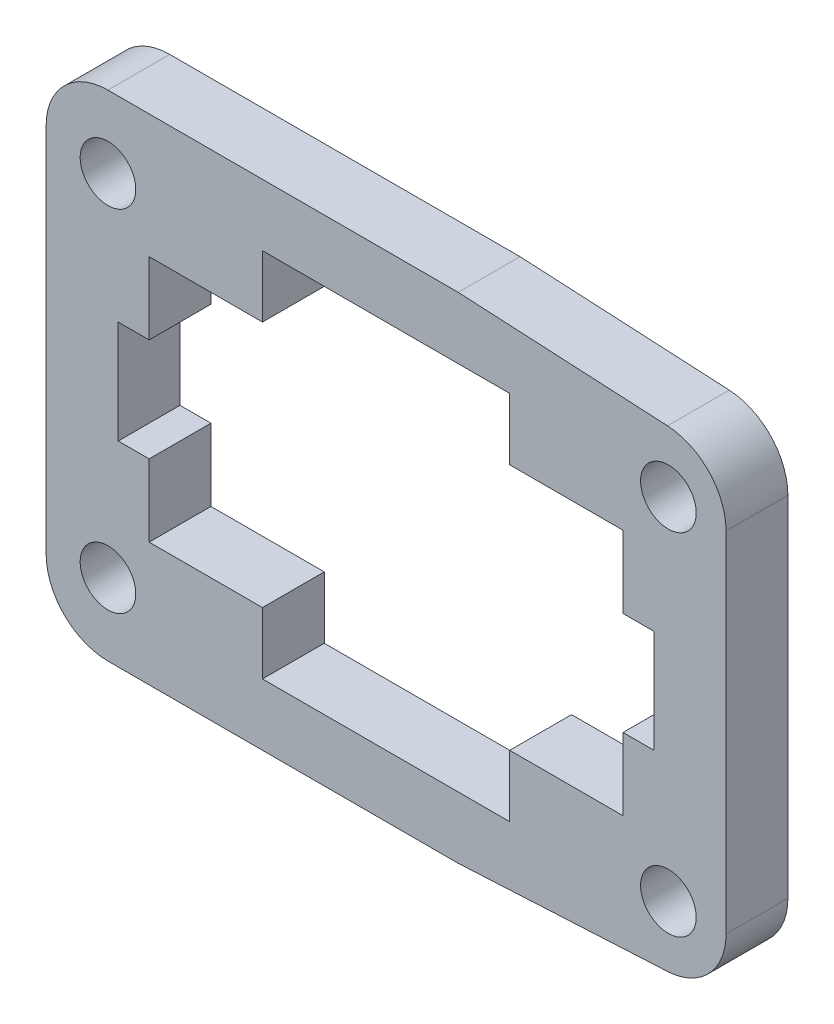
ISO-10303-21;
HEADER;
FILE_DESCRIPTION(('STEP AP214'),'2;1');
FILE_NAME('part.step','',(''),(''),'','','');
FILE_SCHEMA(('AUTOMOTIVE_DESIGN { 1 0 10303 214 1 1 1 1 }'));
ENDSEC;
DATA;
#1=APPLICATION_CONTEXT('core data for automotive mechanical design processes');
#2=APPLICATION_PROTOCOL_DEFINITION('international standard','automotive_design',2000,#1);
#3=PRODUCT_CONTEXT('',#1,'mechanical');
#4=PRODUCT('Part','Part','',(#3));
#5=PRODUCT_RELATED_PRODUCT_CATEGORY('part','',(#4));
#6=PRODUCT_DEFINITION_FORMATION('','',#4);
#7=PRODUCT_DEFINITION_CONTEXT('part definition',#1,'design');
#8=PRODUCT_DEFINITION('design','',#6,#7);
#9=PRODUCT_DEFINITION_SHAPE('','',#8);
#10=(LENGTH_UNIT() NAMED_UNIT(*) SI_UNIT(.MILLI.,.METRE.));
#11=(NAMED_UNIT(*) PLANE_ANGLE_UNIT() SI_UNIT($,.RADIAN.));
#12=(NAMED_UNIT(*) SI_UNIT($,.STERADIAN.) SOLID_ANGLE_UNIT());
#13=UNCERTAINTY_MEASURE_WITH_UNIT(LENGTH_MEASURE(1.E-05),#10,'distance_accuracy_value','');
#14=(GEOMETRIC_REPRESENTATION_CONTEXT(3) GLOBAL_UNCERTAINTY_ASSIGNED_CONTEXT((#13)) GLOBAL_UNIT_ASSIGNED_CONTEXT((#10,
#11,#12)) REPRESENTATION_CONTEXT('',''));
#15=CARTESIAN_POINT('',(0.,0.,0.));
#16=DIRECTION('',(0.,0.,1.));
#17=DIRECTION('',(1.,0.,0.));
#18=AXIS2_PLACEMENT_3D('',#15,#16,#17);
#19=CARTESIAN_POINT('',(-3.15711815612296,20.9998,0.));
#20=DIRECTION('',(0.,0.,1.));
#21=DIRECTION('',(1.,0.,0.));
#22=AXIS2_PLACEMENT_3D('',#19,#20,#21);
#23=CYLINDRICAL_SURFACE('',#22,3.);
#24=CARTESIAN_POINT('',(-3.15711815612296,20.9998,3.));
#25=DIRECTION('',(0.,0.,1.));
#26=DIRECTION('',(1.,0.,0.));
#27=AXIS2_PLACEMENT_3D('',#24,#25,#26);
#28=CIRCLE('',#27,3.);
#29=CARTESIAN_POINT('',(-3.15711815612296,23.9998,3.));
#30=VERTEX_POINT('',#29);
#31=CARTESIAN_POINT('',(-6.15711815612297,20.9998,3.));
#32=VERTEX_POINT('',#31);
#33=EDGE_CURVE('E420',#30,#32,#28,.T.);
#34=ORIENTED_EDGE('',*,*,#33,.F.);
#35=DIRECTION('',(0.,0.,1.));
#36=VECTOR('',#35,1.);
#37=CARTESIAN_POINT('',(-3.15711815612296,23.9998,0.));
#38=LINE('',#37,#36);
#39=CARTESIAN_POINT('',(-3.15711815612296,23.9998,0.));
#40=VERTEX_POINT('',#39);
#41=EDGE_CURVE('E11',#40,#30,#38,.T.);
#42=ORIENTED_EDGE('',*,*,#41,.F.);
#43=CARTESIAN_POINT('',(-3.15711815612296,20.9998,0.));
#44=DIRECTION('',(0.,0.,1.));
#45=DIRECTION('',(1.,0.,0.));
#46=AXIS2_PLACEMENT_3D('',#43,#44,#45);
#47=CIRCLE('',#46,3.);
#48=CARTESIAN_POINT('',(-6.15711815612297,20.9998,0.));
#49=VERTEX_POINT('',#48);
#50=EDGE_CURVE('E423',#40,#49,#47,.T.);
#51=ORIENTED_EDGE('',*,*,#50,.T.);
#52=DIRECTION('',(0.,0.,1.));
#53=VECTOR('',#52,1.);
#54=CARTESIAN_POINT('',(-6.15711815612297,20.9998,0.));
#55=LINE('',#54,#53);
#56=EDGE_CURVE('E40',#49,#32,#55,.T.);
#57=ORIENTED_EDGE('',*,*,#56,.T.);
#58=EDGE_LOOP('',(#34,#42,#51,#57));
#59=FACE_BOUND('',#58,.T.);
#60=ADVANCED_FACE('F37',(#59),#23,.T.);
#61=CARTESIAN_POINT('',(13.8436818438771,23.9998,0.));
#62=DIRECTION('',(0.,1.,0.));
#63=DIRECTION('',(0.,0.,1.));
#64=AXIS2_PLACEMENT_3D('',#61,#62,#63);
#65=PLANE('',#64);
#66=DIRECTION('',(-1.,0.,0.));
#67=VECTOR('',#66,1.);
#68=CARTESIAN_POINT('',(13.8436818438771,23.9998,3.));
#69=LINE('',#68,#67);
#70=CARTESIAN_POINT('',(13.8436818438771,23.9998,3.));
#71=VERTEX_POINT('',#70);
#72=EDGE_CURVE('E427',#71,#30,#69,.T.);
#73=ORIENTED_EDGE('',*,*,#72,.F.);
#74=DIRECTION('',(0.,0.,1.));
#75=VECTOR('',#74,1.);
#76=CARTESIAN_POINT('',(13.8436818438771,23.9998,0.));
#77=LINE('',#76,#75);
#78=CARTESIAN_POINT('',(13.8436818438771,23.9998,0.));
#79=VERTEX_POINT('',#78);
#80=EDGE_CURVE('E45',#79,#71,#77,.T.);
#81=ORIENTED_EDGE('',*,*,#80,.F.);
#82=DIRECTION('',(-1.,0.,0.));
#83=VECTOR('',#82,1.);
#84=CARTESIAN_POINT('',(13.8436818438771,23.9998,0.));
#85=LINE('',#84,#83);
#86=EDGE_CURVE('E451',#79,#40,#85,.T.);
#87=ORIENTED_EDGE('',*,*,#86,.T.);
#88=ORIENTED_EDGE('',*,*,#41,.T.);
#89=EDGE_LOOP('',(#73,#81,#87,#88));
#90=FACE_BOUND('',#89,.T.);
#91=ADVANCED_FACE('F508',(#90),#65,.T.);
#92=CARTESIAN_POINT('',(24.0010920540107,23.4678047027526,0.));
#93=DIRECTION('',(0.0523034033778749,0.998631240245913,0.));
#94=DIRECTION('',(-0.998631240245914,0.0523034033778749,0.));
#95=AXIS2_PLACEMENT_3D('',#92,#93,#94);
#96=PLANE('',#95);
#97=DIRECTION('',(-0.998631240245914,0.0523034033778749,0.));
#98=VECTOR('',#97,1.);
#99=CARTESIAN_POINT('',(24.0010920540107,23.4678047027526,3.));
#100=LINE('',#99,#98);
#101=CARTESIAN_POINT('',(24.0010920540107,23.4678047027526,3.));
#102=VERTEX_POINT('',#101);
#103=EDGE_CURVE('E477',#102,#71,#100,.T.);
#104=ORIENTED_EDGE('',*,*,#103,.F.);
#105=DIRECTION('',(0.,0.,1.));
#106=VECTOR('',#105,1.);
#107=CARTESIAN_POINT('',(24.0010920540107,23.4678047027526,0.));
#108=LINE('',#107,#106);
#109=CARTESIAN_POINT('',(24.0010920540107,23.4678047027526,0.));
#110=VERTEX_POINT('',#109);
#111=EDGE_CURVE('E483',#110,#102,#108,.T.);
#112=ORIENTED_EDGE('',*,*,#111,.F.);
#113=DIRECTION('',(-0.998631240245914,0.0523034033778749,0.));
#114=VECTOR('',#113,1.);
#115=CARTESIAN_POINT('',(24.0010920540107,23.4678047027526,0.));
#116=LINE('',#115,#114);
#117=EDGE_CURVE('E448',#110,#79,#116,.T.);
#118=ORIENTED_EDGE('',*,*,#117,.T.);
#119=ORIENTED_EDGE('',*,*,#80,.T.);
#120=EDGE_LOOP('',(#104,#112,#118,#119));
#121=FACE_BOUND('',#120,.T.);
#122=ADVANCED_FACE('F536',(#121),#96,.T.);
#123=CARTESIAN_POINT('',(23.844181843877,20.4719109820149,0.));
#124=DIRECTION('',(0.,0.,1.));
#125=DIRECTION('',(1.,0.,0.));
#126=AXIS2_PLACEMENT_3D('',#123,#124,#125);
#127=CYLINDRICAL_SURFACE('',#126,3.00000000000001);
#128=CARTESIAN_POINT('',(23.844181843877,20.4719109820149,3.));
#129=DIRECTION('',(0.,0.,1.));
#130=DIRECTION('',(1.,0.,0.));
#131=AXIS2_PLACEMENT_3D('',#128,#129,#130);
#132=CIRCLE('',#131,3.00000000000001);
#133=CARTESIAN_POINT('',(26.844181843877,20.4719109820149,3.));
#134=VERTEX_POINT('',#133);
#135=EDGE_CURVE('E474',#134,#102,#132,.T.);
#136=ORIENTED_EDGE('',*,*,#135,.F.);
#137=DIRECTION('',(0.,0.,1.));
#138=VECTOR('',#137,1.);
#139=CARTESIAN_POINT('',(26.844181843877,20.4719109820149,0.));
#140=LINE('',#139,#138);
#141=CARTESIAN_POINT('',(26.844181843877,20.4719109820149,0.));
#142=VERTEX_POINT('',#141);
#143=EDGE_CURVE('E485',#142,#134,#140,.T.);
#144=ORIENTED_EDGE('',*,*,#143,.F.);
#145=CARTESIAN_POINT('',(23.844181843877,20.4719109820149,0.));
#146=DIRECTION('',(0.,0.,1.));
#147=DIRECTION('',(1.,0.,0.));
#148=AXIS2_PLACEMENT_3D('',#145,#146,#147);
#149=CIRCLE('',#148,3.00000000000001);
#150=EDGE_CURVE('E445',#142,#110,#149,.T.);
#151=ORIENTED_EDGE('',*,*,#150,.T.);
#152=ORIENTED_EDGE('',*,*,#111,.T.);
#153=EDGE_LOOP('',(#136,#144,#151,#152));
#154=FACE_BOUND('',#153,.T.);
#155=ADVANCED_FACE('F534',(#154),#127,.T.);
#156=CARTESIAN_POINT('',(26.844181843877,3.52888902362418,0.));
#157=DIRECTION('',(1.,0.,0.));
#158=DIRECTION('',(0.,0.,-1.));
#159=AXIS2_PLACEMENT_3D('',#156,#157,#158);
#160=PLANE('',#159);
#161=DIRECTION('',(0.,1.,0.));
#162=VECTOR('',#161,1.);
#163=CARTESIAN_POINT('',(26.844181843877,3.52888902362418,3.));
#164=LINE('',#163,#162);
#165=CARTESIAN_POINT('',(26.844181843877,3.52888902362418,3.));
#166=VERTEX_POINT('',#165);
#167=EDGE_CURVE('E471',#166,#134,#164,.T.);
#168=ORIENTED_EDGE('',*,*,#167,.F.);
#169=DIRECTION('',(0.,0.,1.));
#170=VECTOR('',#169,1.);
#171=CARTESIAN_POINT('',(26.844181843877,3.52888902362418,0.));
#172=LINE('',#171,#170);
#173=CARTESIAN_POINT('',(26.844181843877,3.52888902362418,0.));
#174=VERTEX_POINT('',#173);
#175=EDGE_CURVE('E487',#174,#166,#172,.T.);
#176=ORIENTED_EDGE('',*,*,#175,.F.);
#177=DIRECTION('',(0.,1.,0.));
#178=VECTOR('',#177,1.);
#179=CARTESIAN_POINT('',(26.844181843877,3.52888902362418,0.));
#180=LINE('',#179,#178);
#181=EDGE_CURVE('E442',#174,#142,#180,.T.);
#182=ORIENTED_EDGE('',*,*,#181,.T.);
#183=ORIENTED_EDGE('',*,*,#143,.T.);
#184=EDGE_LOOP('',(#168,#176,#182,#183));
#185=FACE_BOUND('',#184,.T.);
#186=ADVANCED_FACE('F530',(#185),#160,.T.);
#187=CARTESIAN_POINT('',(23.844181843877,3.52888902362418,0.));
#188=DIRECTION('',(0.,0.,1.));
#189=DIRECTION('',(1.,0.,0.));
#190=AXIS2_PLACEMENT_3D('',#187,#188,#189);
#191=CYLINDRICAL_SURFACE('',#190,3.);
#192=CARTESIAN_POINT('',(23.844181843877,3.52888902362418,3.));
#193=DIRECTION('',(0.,0.,1.));
#194=DIRECTION('',(1.,0.,0.));
#195=AXIS2_PLACEMENT_3D('',#192,#193,#194);
#196=CIRCLE('',#195,3.);
#197=CARTESIAN_POINT('',(24.0013861888822,0.533010722706153,3.));
#198=VERTEX_POINT('',#197);
#199=EDGE_CURVE('E468',#198,#166,#196,.T.);
#200=ORIENTED_EDGE('',*,*,#199,.F.);
#201=DIRECTION('',(0.,0.,1.));
#202=VECTOR('',#201,1.);
#203=CARTESIAN_POINT('',(24.0013861888822,0.533010722706153,0.));
#204=LINE('',#203,#202);
#205=CARTESIAN_POINT('',(24.0013861888822,0.533010722706153,0.));
#206=VERTEX_POINT('',#205);
#207=EDGE_CURVE('E489',#206,#198,#204,.T.);
#208=ORIENTED_EDGE('',*,*,#207,.F.);
#209=CARTESIAN_POINT('',(23.844181843877,3.52888902362418,0.));
#210=DIRECTION('',(0.,0.,1.));
#211=DIRECTION('',(1.,0.,0.));
#212=AXIS2_PLACEMENT_3D('',#209,#210,#211);
#213=CIRCLE('',#212,3.);
#214=EDGE_CURVE('E439',#206,#174,#213,.T.);
#215=ORIENTED_EDGE('',*,*,#214,.T.);
#216=ORIENTED_EDGE('',*,*,#175,.T.);
#217=EDGE_LOOP('',(#200,#208,#215,#216));
#218=FACE_BOUND('',#217,.T.);
#219=ADVANCED_FACE('F526',(#218),#191,.T.);
#220=CARTESIAN_POINT('',(13.8436818438771,0.,0.));
#221=DIRECTION('',(0.0524014483350334,-0.998626100306011,0.));
#222=DIRECTION('',(0.998626100306011,0.0524014483350334,0.));
#223=AXIS2_PLACEMENT_3D('',#220,#221,#222);
#224=PLANE('',#223);
#225=DIRECTION('',(0.998626100306011,0.0524014483350334,0.));
#226=VECTOR('',#225,1.);
#227=CARTESIAN_POINT('',(13.8436818438771,0.,3.));
#228=LINE('',#227,#226);
#229=CARTESIAN_POINT('',(13.8436818438771,0.,3.));
#230=VERTEX_POINT('',#229);
#231=EDGE_CURVE('E465',#230,#198,#228,.T.);
#232=ORIENTED_EDGE('',*,*,#231,.F.);
#233=DIRECTION('',(0.,0.,1.));
#234=VECTOR('',#233,1.);
#235=CARTESIAN_POINT('',(13.8436818438771,0.,0.));
#236=LINE('',#235,#234);
#237=CARTESIAN_POINT('',(13.8436818438771,0.,0.));
#238=VERTEX_POINT('',#237);
#239=EDGE_CURVE('E491',#238,#230,#236,.T.);
#240=ORIENTED_EDGE('',*,*,#239,.F.);
#241=DIRECTION('',(0.998626100306011,0.0524014483350334,0.));
#242=VECTOR('',#241,1.);
#243=CARTESIAN_POINT('',(13.8436818438771,0.,0.));
#244=LINE('',#243,#242);
#245=EDGE_CURVE('E436',#238,#206,#244,.T.);
#246=ORIENTED_EDGE('',*,*,#245,.T.);
#247=ORIENTED_EDGE('',*,*,#207,.T.);
#248=EDGE_LOOP('',(#232,#240,#246,#247));
#249=FACE_BOUND('',#248,.T.);
#250=ADVANCED_FACE('F522',(#249),#224,.T.);
#251=CARTESIAN_POINT('',(-3.15711815612296,0.,0.));
#252=DIRECTION('',(0.,-1.,0.));
#253=DIRECTION('',(1.,0.,0.));
#254=AXIS2_PLACEMENT_3D('',#251,#252,#253);
#255=PLANE('',#254);
#256=DIRECTION('',(1.,0.,0.));
#257=VECTOR('',#256,1.);
#258=CARTESIAN_POINT('',(-3.15711815612296,0.,3.));
#259=LINE('',#258,#257);
#260=CARTESIAN_POINT('',(-3.15711815612297,0.,3.));
#261=VERTEX_POINT('',#260);
#262=EDGE_CURVE('E462',#261,#230,#259,.T.);
#263=ORIENTED_EDGE('',*,*,#262,.F.);
#264=DIRECTION('',(0.,0.,1.));
#265=VECTOR('',#264,1.);
#266=CARTESIAN_POINT('',(-3.15711815612297,0.,0.));
#267=LINE('',#266,#265);
#268=CARTESIAN_POINT('',(-3.15711815612297,0.,0.));
#269=VERTEX_POINT('',#268);
#270=EDGE_CURVE('E493',#269,#261,#267,.T.);
#271=ORIENTED_EDGE('',*,*,#270,.F.);
#272=DIRECTION('',(1.,0.,0.));
#273=VECTOR('',#272,1.);
#274=CARTESIAN_POINT('',(-3.15711815612296,0.,0.));
#275=LINE('',#274,#273);
#276=EDGE_CURVE('E433',#269,#238,#275,.T.);
#277=ORIENTED_EDGE('',*,*,#276,.T.);
#278=ORIENTED_EDGE('',*,*,#239,.T.);
#279=EDGE_LOOP('',(#263,#271,#277,#278));
#280=FACE_BOUND('',#279,.T.);
#281=ADVANCED_FACE('F520',(#280),#255,.T.);
#282=CARTESIAN_POINT('',(-3.15711815612296,3.,0.));
#283=DIRECTION('',(0.,0.,1.));
#284=DIRECTION('',(1.,0.,0.));
#285=AXIS2_PLACEMENT_3D('',#282,#283,#284);
#286=CYLINDRICAL_SURFACE('',#285,3.);
#287=CARTESIAN_POINT('',(-3.15711815612296,3.,3.));
#288=DIRECTION('',(0.,0.,1.));
#289=DIRECTION('',(1.,0.,0.));
#290=AXIS2_PLACEMENT_3D('',#287,#288,#289);
#291=CIRCLE('',#290,3.);
#292=CARTESIAN_POINT('',(-6.15711815612297,3.,3.));
#293=VERTEX_POINT('',#292);
#294=EDGE_CURVE('E459',#293,#261,#291,.T.);
#295=ORIENTED_EDGE('',*,*,#294,.F.);
#296=DIRECTION('',(0.,0.,1.));
#297=VECTOR('',#296,1.);
#298=CARTESIAN_POINT('',(-6.15711815612297,3.,0.));
#299=LINE('',#298,#297);
#300=CARTESIAN_POINT('',(-6.15711815612297,3.,0.));
#301=VERTEX_POINT('',#300);
#302=EDGE_CURVE('E494',#301,#293,#299,.T.);
#303=ORIENTED_EDGE('',*,*,#302,.F.);
#304=CARTESIAN_POINT('',(-3.15711815612296,3.,0.));
#305=DIRECTION('',(0.,0.,1.));
#306=DIRECTION('',(1.,0.,0.));
#307=AXIS2_PLACEMENT_3D('',#304,#305,#306);
#308=CIRCLE('',#307,3.);
#309=EDGE_CURVE('E430',#301,#269,#308,.T.);
#310=ORIENTED_EDGE('',*,*,#309,.T.);
#311=ORIENTED_EDGE('',*,*,#270,.T.);
#312=EDGE_LOOP('',(#295,#303,#310,#311));
#313=FACE_BOUND('',#312,.T.);
#314=ADVANCED_FACE('F516',(#313),#286,.T.);
#315=CARTESIAN_POINT('',(-6.15711815612297,20.9998,0.));
#316=DIRECTION('',(-1.,0.,0.));
#317=DIRECTION('',(0.,0.,1.));
#318=AXIS2_PLACEMENT_3D('',#315,#316,#317);
#319=PLANE('',#318);
#320=DIRECTION('',(0.,-1.,0.));
#321=VECTOR('',#320,1.);
#322=CARTESIAN_POINT('',(-6.15711815612297,20.9998,3.));
#323=LINE('',#322,#321);
#324=EDGE_CURVE('E456',#32,#293,#323,.T.);
#325=ORIENTED_EDGE('',*,*,#324,.F.);
#326=ORIENTED_EDGE('',*,*,#56,.F.);
#327=DIRECTION('',(0.,-1.,0.));
#328=VECTOR('',#327,1.);
#329=CARTESIAN_POINT('',(-6.15711815612297,20.9998,0.));
#330=LINE('',#329,#328);
#331=EDGE_CURVE('E426',#49,#301,#330,.T.);
#332=ORIENTED_EDGE('',*,*,#331,.T.);
#333=ORIENTED_EDGE('',*,*,#302,.T.);
#334=EDGE_LOOP('',(#325,#326,#332,#333));
#335=FACE_BOUND('',#334,.T.);
#336=ADVANCED_FACE('F502',(#335),#319,.T.);
#337=CARTESIAN_POINT('',(-3.15711815612296,20.9998,0.));
#338=DIRECTION('',(0.,0.,1.));
#339=DIRECTION('',(1.,0.,0.));
#340=AXIS2_PLACEMENT_3D('',#337,#338,#339);
#341=PLANE('',#340);
#342=DIRECTION('',(1.,0.,0.));
#343=VECTOR('',#342,1.);
#344=CARTESIAN_POINT('',(23.343481843877,9.5,0.));
#345=LINE('',#344,#343);
#346=CARTESIAN_POINT('',(21.843181843877,9.5,0.));
#347=VERTEX_POINT('',#346);
#348=CARTESIAN_POINT('',(23.343481843877,9.5,0.));
#349=VERTEX_POINT('',#348);
#350=EDGE_CURVE('E242',#347,#349,#345,.T.);
#351=ORIENTED_EDGE('',*,*,#350,.T.);
#352=DIRECTION('',(0.,1.,0.));
#353=VECTOR('',#352,1.);
#354=CARTESIAN_POINT('',(23.343481843877,14.4995,0.));
#355=LINE('',#354,#353);
#356=CARTESIAN_POINT('',(23.343481843877,14.4995,0.));
#357=VERTEX_POINT('',#356);
#358=EDGE_CURVE('E236',#349,#357,#355,.T.);
#359=ORIENTED_EDGE('',*,*,#358,.T.);
#360=DIRECTION('',(-1.,0.,0.));
#361=VECTOR('',#360,1.);
#362=CARTESIAN_POINT('',(21.843181843877,14.4995,0.));
#363=LINE('',#362,#361);
#364=CARTESIAN_POINT('',(21.843181843877,14.4995,0.));
#365=VERTEX_POINT('',#364);
#366=EDGE_CURVE('E245',#357,#365,#363,.T.);
#367=ORIENTED_EDGE('',*,*,#366,.T.);
#368=DIRECTION('',(0.,1.,0.));
#369=VECTOR('',#368,1.);
#370=CARTESIAN_POINT('',(21.843181843877,17.9998,0.));
#371=LINE('',#370,#369);
#372=CARTESIAN_POINT('',(21.843181843877,17.9998,0.));
#373=VERTEX_POINT('',#372);
#374=EDGE_CURVE('E53',#365,#373,#371,.T.);
#375=ORIENTED_EDGE('',*,*,#374,.T.);
#376=DIRECTION('',(-1.,0.,0.));
#377=VECTOR('',#376,1.);
#378=CARTESIAN_POINT('',(16.3433818438771,17.9998,0.));
#379=LINE('',#378,#377);
#380=CARTESIAN_POINT('',(16.3433818438771,17.9998,0.));
#381=VERTEX_POINT('',#380);
#382=EDGE_CURVE('E260',#373,#381,#379,.T.);
#383=ORIENTED_EDGE('',*,*,#382,.T.);
#384=DIRECTION('',(0.,1.,0.));
#385=VECTOR('',#384,1.);
#386=CARTESIAN_POINT('',(16.3433818438771,20.9998,0.));
#387=LINE('',#386,#385);
#388=CARTESIAN_POINT('',(16.3433818438771,20.9998,0.));
#389=VERTEX_POINT('',#388);
#390=EDGE_CURVE('E263',#381,#389,#387,.T.);
#391=ORIENTED_EDGE('',*,*,#390,.T.);
#392=DIRECTION('',(-1.,0.,0.));
#393=VECTOR('',#392,1.);
#394=CARTESIAN_POINT('',(4.34338184387702,20.9998,0.));
#395=LINE('',#394,#393);
#396=CARTESIAN_POINT('',(4.34338184387702,20.9998,0.));
#397=VERTEX_POINT('',#396);
#398=EDGE_CURVE('E266',#389,#397,#395,.T.);
#399=ORIENTED_EDGE('',*,*,#398,.T.);
#400=DIRECTION('',(0.,-1.,0.));
#401=VECTOR('',#400,1.);
#402=CARTESIAN_POINT('',(4.34338184387702,17.9998,0.));
#403=LINE('',#402,#401);
#404=CARTESIAN_POINT('',(4.34338184387702,17.9998,0.));
#405=VERTEX_POINT('',#404);
#406=EDGE_CURVE('E269',#397,#405,#403,.T.);
#407=ORIENTED_EDGE('',*,*,#406,.T.);
#408=DIRECTION('',(-1.,0.,0.));
#409=VECTOR('',#408,1.);
#410=CARTESIAN_POINT('',(-1.15651815612298,17.9998,0.));
#411=LINE('',#410,#409);
#412=CARTESIAN_POINT('',(-1.15651815612298,17.9998,0.));
#413=VERTEX_POINT('',#412);
#414=EDGE_CURVE('E272',#405,#413,#411,.T.);
#415=ORIENTED_EDGE('',*,*,#414,.T.);
#416=DIRECTION('',(0.,-1.,0.));
#417=VECTOR('',#416,1.);
#418=CARTESIAN_POINT('',(-1.15651815612297,14.4995,0.));
#419=LINE('',#418,#417);
#420=CARTESIAN_POINT('',(-1.15651815612297,14.4995,0.));
#421=VERTEX_POINT('',#420);
#422=EDGE_CURVE('E275',#413,#421,#419,.T.);
#423=ORIENTED_EDGE('',*,*,#422,.T.);
#424=DIRECTION('',(-1.,0.,0.));
#425=VECTOR('',#424,1.);
#426=CARTESIAN_POINT('',(-2.65681815612294,14.4995,0.));
#427=LINE('',#426,#425);
#428=CARTESIAN_POINT('',(-2.65681815612294,14.4995,0.));
#429=VERTEX_POINT('',#428);
#430=EDGE_CURVE('E278',#421,#429,#427,.T.);
#431=ORIENTED_EDGE('',*,*,#430,.T.);
#432=DIRECTION('',(0.,-1.,0.));
#433=VECTOR('',#432,1.);
#434=CARTESIAN_POINT('',(-2.65681815612294,9.5,0.));
#435=LINE('',#434,#433);
#436=CARTESIAN_POINT('',(-2.65681815612294,9.5,0.));
#437=VERTEX_POINT('',#436);
#438=EDGE_CURVE('E281',#429,#437,#435,.T.);
#439=ORIENTED_EDGE('',*,*,#438,.T.);
#440=DIRECTION('',(1.,0.,0.));
#441=VECTOR('',#440,1.);
#442=CARTESIAN_POINT('',(-1.15651815612297,9.5,0.));
#443=LINE('',#442,#441);
#444=CARTESIAN_POINT('',(-1.15651815612297,9.5,0.));
#445=VERTEX_POINT('',#444);
#446=EDGE_CURVE('E284',#437,#445,#443,.T.);
#447=ORIENTED_EDGE('',*,*,#446,.T.);
#448=DIRECTION('',(0.,-1.,0.));
#449=VECTOR('',#448,1.);
#450=CARTESIAN_POINT('',(-1.15651815612298,6.,0.));
#451=LINE('',#450,#449);
#452=CARTESIAN_POINT('',(-1.15651815612298,6.,0.));
#453=VERTEX_POINT('',#452);
#454=EDGE_CURVE('E287',#445,#453,#451,.T.);
#455=ORIENTED_EDGE('',*,*,#454,.T.);
#456=DIRECTION('',(1.,0.,0.));
#457=VECTOR('',#456,1.);
#458=CARTESIAN_POINT('',(4.34338184387701,6.,0.));
#459=LINE('',#458,#457);
#460=CARTESIAN_POINT('',(4.34338184387701,6.,0.));
#461=VERTEX_POINT('',#460);
#462=EDGE_CURVE('E290',#453,#461,#459,.T.);
#463=ORIENTED_EDGE('',*,*,#462,.T.);
#464=DIRECTION('',(0.,-1.,0.));
#465=VECTOR('',#464,1.);
#466=CARTESIAN_POINT('',(4.34338184387701,3.,0.));
#467=LINE('',#466,#465);
#468=CARTESIAN_POINT('',(4.34338184387701,3.,0.));
#469=VERTEX_POINT('',#468);
#470=EDGE_CURVE('E293',#461,#469,#467,.T.);
#471=ORIENTED_EDGE('',*,*,#470,.T.);
#472=DIRECTION('',(1.,0.,0.));
#473=VECTOR('',#472,1.);
#474=CARTESIAN_POINT('',(16.3433818438771,3.,0.));
#475=LINE('',#474,#473);
#476=CARTESIAN_POINT('',(16.3433818438771,3.,0.));
#477=VERTEX_POINT('',#476);
#478=EDGE_CURVE('E296',#469,#477,#475,.T.);
#479=ORIENTED_EDGE('',*,*,#478,.T.);
#480=DIRECTION('',(0.,1.,0.));
#481=VECTOR('',#480,1.);
#482=CARTESIAN_POINT('',(16.3433818438771,6.,0.));
#483=LINE('',#482,#481);
#484=CARTESIAN_POINT('',(16.3433818438771,6.,0.));
#485=VERTEX_POINT('',#484);
#486=EDGE_CURVE('E299',#477,#485,#483,.T.);
#487=ORIENTED_EDGE('',*,*,#486,.T.);
#488=DIRECTION('',(1.,0.,0.));
#489=VECTOR('',#488,1.);
#490=CARTESIAN_POINT('',(21.843181843877,6.,0.));
#491=LINE('',#490,#489);
#492=CARTESIAN_POINT('',(21.843181843877,6.,0.));
#493=VERTEX_POINT('',#492);
#494=EDGE_CURVE('E302',#485,#493,#491,.T.);
#495=ORIENTED_EDGE('',*,*,#494,.T.);
#496=DIRECTION('',(0.,1.,0.));
#497=VECTOR('',#496,1.);
#498=CARTESIAN_POINT('',(21.843181843877,9.5,0.));
#499=LINE('',#498,#497);
#500=EDGE_CURVE('E305',#493,#347,#499,.T.);
#501=ORIENTED_EDGE('',*,*,#500,.T.);
#502=EDGE_LOOP('',(#351,#359,#367,#375,#383,#391,#399,#407,#415,#423,#431,#439,#447,#455,#463,
#471,#479,#487,#495,#501));
#503=FACE_BOUND('',#502,.T.);
#504=CARTESIAN_POINT('',(24.044031843877,3.50114834928544,0.));
#505=DIRECTION('',(0.,0.,1.));
#506=DIRECTION('',(-1.,0.,0.));
#507=AXIS2_PLACEMENT_3D('',#504,#505,#506);
#508=CIRCLE('',#507,1.35);
#509=CARTESIAN_POINT('',(22.694031843877,3.50114834928544,0.));
#510=VERTEX_POINT('',#509);
#511=EDGE_CURVE('E399',#510,#510,#508,.T.);
#512=ORIENTED_EDGE('',*,*,#511,.T.);
#513=EDGE_LOOP('',(#512));
#514=FACE_BOUND('',#513,.T.);
#515=CARTESIAN_POINT('',(-3.15601815612294,3.50114834928544,0.));
#516=DIRECTION('',(0.,0.,1.));
#517=DIRECTION('',(-1.,0.,0.));
#518=AXIS2_PLACEMENT_3D('',#515,#516,#517);
#519=CIRCLE('',#518,1.35);
#520=CARTESIAN_POINT('',(-4.50601815612294,3.50114834928544,0.));
#521=VERTEX_POINT('',#520);
#522=EDGE_CURVE('E405',#521,#521,#519,.T.);
#523=ORIENTED_EDGE('',*,*,#522,.T.);
#524=EDGE_LOOP('',(#523));
#525=FACE_BOUND('',#524,.T.);
#526=CARTESIAN_POINT('',(24.044031843877,20.4983516507146,0.));
#527=DIRECTION('',(0.,0.,1.));
#528=DIRECTION('',(-1.,0.,0.));
#529=AXIS2_PLACEMENT_3D('',#526,#527,#528);
#530=CIRCLE('',#529,1.35);
#531=CARTESIAN_POINT('',(22.694031843877,20.4983516507146,0.));
#532=VERTEX_POINT('',#531);
#533=EDGE_CURVE('E411',#532,#532,#530,.T.);
#534=ORIENTED_EDGE('',*,*,#533,.T.);
#535=EDGE_LOOP('',(#534));
#536=FACE_BOUND('',#535,.T.);
#537=CARTESIAN_POINT('',(-3.15601815612294,20.4983516507146,0.));
#538=DIRECTION('',(0.,0.,1.));
#539=DIRECTION('',(-1.,0.,0.));
#540=AXIS2_PLACEMENT_3D('',#537,#538,#539);
#541=CIRCLE('',#540,1.35);
#542=CARTESIAN_POINT('',(-4.50601815612294,20.4983516507146,0.));
#543=VERTEX_POINT('',#542);
#544=EDGE_CURVE('E417',#543,#543,#541,.T.);
#545=ORIENTED_EDGE('',*,*,#544,.T.);
#546=EDGE_LOOP('',(#545));
#547=FACE_BOUND('',#546,.T.);
#548=ORIENTED_EDGE('',*,*,#50,.F.);
#549=ORIENTED_EDGE('',*,*,#86,.F.);
#550=ORIENTED_EDGE('',*,*,#117,.F.);
#551=ORIENTED_EDGE('',*,*,#150,.F.);
#552=ORIENTED_EDGE('',*,*,#181,.F.);
#553=ORIENTED_EDGE('',*,*,#214,.F.);
#554=ORIENTED_EDGE('',*,*,#245,.F.);
#555=ORIENTED_EDGE('',*,*,#276,.F.);
#556=ORIENTED_EDGE('',*,*,#309,.F.);
#557=ORIENTED_EDGE('',*,*,#331,.F.);
#558=EDGE_LOOP('',(#548,#549,#550,#551,#552,#553,#554,#555,#556,#557));
#559=FACE_BOUND('',#558,.T.);
#560=ADVANCED_FACE('F249',(#503,#514,#525,#536,#547,#559),#341,.F.);
#561=CARTESIAN_POINT('',(-3.15711815612296,20.9998,3.));
#562=DIRECTION('',(0.,0.,1.));
#563=DIRECTION('',(1.,0.,0.));
#564=AXIS2_PLACEMENT_3D('',#561,#562,#563);
#565=PLANE('',#564);
#566=DIRECTION('',(0.,1.,0.));
#567=VECTOR('',#566,1.);
#568=CARTESIAN_POINT('',(23.343481843877,14.4995,3.));
#569=LINE('',#568,#567);
#570=CARTESIAN_POINT('',(23.343481843877,9.5,3.));
#571=VERTEX_POINT('',#570);
#572=CARTESIAN_POINT('',(23.343481843877,14.4995,3.));
#573=VERTEX_POINT('',#572);
#574=EDGE_CURVE('E61',#571,#573,#569,.T.);
#575=ORIENTED_EDGE('',*,*,#574,.F.);
#576=DIRECTION('',(1.,0.,0.));
#577=VECTOR('',#576,1.);
#578=CARTESIAN_POINT('',(23.343481843877,9.5,3.));
#579=LINE('',#578,#577);
#580=CARTESIAN_POINT('',(21.843181843877,9.5,3.));
#581=VERTEX_POINT('',#580);
#582=EDGE_CURVE('E253',#581,#571,#579,.T.);
#583=ORIENTED_EDGE('',*,*,#582,.F.);
#584=DIRECTION('',(0.,1.,0.));
#585=VECTOR('',#584,1.);
#586=CARTESIAN_POINT('',(21.843181843877,9.5,3.));
#587=LINE('',#586,#585);
#588=CARTESIAN_POINT('',(21.843181843877,6.,3.));
#589=VERTEX_POINT('',#588);
#590=EDGE_CURVE('E256',#589,#581,#587,.T.);
#591=ORIENTED_EDGE('',*,*,#590,.F.);
#592=DIRECTION('',(1.,0.,0.));
#593=VECTOR('',#592,1.);
#594=CARTESIAN_POINT('',(21.843181843877,6.,3.));
#595=LINE('',#594,#593);
#596=CARTESIAN_POINT('',(16.3433818438771,6.,3.));
#597=VERTEX_POINT('',#596);
#598=EDGE_CURVE('E356',#597,#589,#595,.T.);
#599=ORIENTED_EDGE('',*,*,#598,.F.);
#600=DIRECTION('',(0.,1.,0.));
#601=VECTOR('',#600,1.);
#602=CARTESIAN_POINT('',(16.3433818438771,6.,3.));
#603=LINE('',#602,#601);
#604=CARTESIAN_POINT('',(16.3433818438771,3.,3.));
#605=VERTEX_POINT('',#604);
#606=EDGE_CURVE('E353',#605,#597,#603,.T.);
#607=ORIENTED_EDGE('',*,*,#606,.F.);
#608=DIRECTION('',(1.,0.,0.));
#609=VECTOR('',#608,1.);
#610=CARTESIAN_POINT('',(16.3433818438771,3.,3.));
#611=LINE('',#610,#609);
#612=CARTESIAN_POINT('',(4.34338184387701,3.,3.));
#613=VERTEX_POINT('',#612);
#614=EDGE_CURVE('E350',#613,#605,#611,.T.);
#615=ORIENTED_EDGE('',*,*,#614,.F.);
#616=DIRECTION('',(0.,-1.,0.));
#617=VECTOR('',#616,1.);
#618=CARTESIAN_POINT('',(4.34338184387701,3.,3.));
#619=LINE('',#618,#617);
#620=CARTESIAN_POINT('',(4.34338184387701,6.,3.));
#621=VERTEX_POINT('',#620);
#622=EDGE_CURVE('E347',#621,#613,#619,.T.);
#623=ORIENTED_EDGE('',*,*,#622,.F.);
#624=DIRECTION('',(1.,0.,0.));
#625=VECTOR('',#624,1.);
#626=CARTESIAN_POINT('',(4.34338184387701,6.,3.));
#627=LINE('',#626,#625);
#628=CARTESIAN_POINT('',(-1.15651815612298,6.,3.));
#629=VERTEX_POINT('',#628);
#630=EDGE_CURVE('E344',#629,#621,#627,.T.);
#631=ORIENTED_EDGE('',*,*,#630,.F.);
#632=DIRECTION('',(0.,-1.,0.));
#633=VECTOR('',#632,1.);
#634=CARTESIAN_POINT('',(-1.15651815612298,6.,3.));
#635=LINE('',#634,#633);
#636=CARTESIAN_POINT('',(-1.15651815612297,9.5,3.));
#637=VERTEX_POINT('',#636);
#638=EDGE_CURVE('E341',#637,#629,#635,.T.);
#639=ORIENTED_EDGE('',*,*,#638,.F.);
#640=DIRECTION('',(1.,0.,0.));
#641=VECTOR('',#640,1.);
#642=CARTESIAN_POINT('',(-1.15651815612297,9.5,3.));
#643=LINE('',#642,#641);
#644=CARTESIAN_POINT('',(-2.65681815612294,9.5,3.));
#645=VERTEX_POINT('',#644);
#646=EDGE_CURVE('E338',#645,#637,#643,.T.);
#647=ORIENTED_EDGE('',*,*,#646,.F.);
#648=DIRECTION('',(0.,-1.,0.));
#649=VECTOR('',#648,1.);
#650=CARTESIAN_POINT('',(-2.65681815612294,9.5,3.));
#651=LINE('',#650,#649);
#652=CARTESIAN_POINT('',(-2.65681815612294,14.4995,3.));
#653=VERTEX_POINT('',#652);
#654=EDGE_CURVE('E335',#653,#645,#651,.T.);
#655=ORIENTED_EDGE('',*,*,#654,.F.);
#656=DIRECTION('',(-1.,0.,0.));
#657=VECTOR('',#656,1.);
#658=CARTESIAN_POINT('',(-2.65681815612294,14.4995,3.));
#659=LINE('',#658,#657);
#660=CARTESIAN_POINT('',(-1.15651815612297,14.4995,3.));
#661=VERTEX_POINT('',#660);
#662=EDGE_CURVE('E332',#661,#653,#659,.T.);
#663=ORIENTED_EDGE('',*,*,#662,.F.);
#664=DIRECTION('',(0.,-1.,0.));
#665=VECTOR('',#664,1.);
#666=CARTESIAN_POINT('',(-1.15651815612297,14.4995,3.));
#667=LINE('',#666,#665);
#668=CARTESIAN_POINT('',(-1.15651815612298,17.9998,3.));
#669=VERTEX_POINT('',#668);
#670=EDGE_CURVE('E329',#669,#661,#667,.T.);
#671=ORIENTED_EDGE('',*,*,#670,.F.);
#672=DIRECTION('',(-1.,0.,0.));
#673=VECTOR('',#672,1.);
#674=CARTESIAN_POINT('',(-1.15651815612298,17.9998,3.));
#675=LINE('',#674,#673);
#676=CARTESIAN_POINT('',(4.34338184387702,17.9998,3.));
#677=VERTEX_POINT('',#676);
#678=EDGE_CURVE('E326',#677,#669,#675,.T.);
#679=ORIENTED_EDGE('',*,*,#678,.F.);
#680=DIRECTION('',(0.,-1.,0.));
#681=VECTOR('',#680,1.);
#682=CARTESIAN_POINT('',(4.34338184387702,17.9998,3.));
#683=LINE('',#682,#681);
#684=CARTESIAN_POINT('',(4.34338184387702,20.9998,3.));
#685=VERTEX_POINT('',#684);
#686=EDGE_CURVE('E323',#685,#677,#683,.T.);
#687=ORIENTED_EDGE('',*,*,#686,.F.);
#688=DIRECTION('',(-1.,0.,0.));
#689=VECTOR('',#688,1.);
#690=CARTESIAN_POINT('',(4.34338184387702,20.9998,3.));
#691=LINE('',#690,#689);
#692=CARTESIAN_POINT('',(16.3433818438771,20.9998,3.));
#693=VERTEX_POINT('',#692);
#694=EDGE_CURVE('E320',#693,#685,#691,.T.);
#695=ORIENTED_EDGE('',*,*,#694,.F.);
#696=DIRECTION('',(0.,1.,0.));
#697=VECTOR('',#696,1.);
#698=CARTESIAN_POINT('',(16.3433818438771,20.9998,3.));
#699=LINE('',#698,#697);
#700=CARTESIAN_POINT('',(16.3433818438771,17.9998,3.));
#701=VERTEX_POINT('',#700);
#702=EDGE_CURVE('E317',#701,#693,#699,.T.);
#703=ORIENTED_EDGE('',*,*,#702,.F.);
#704=DIRECTION('',(-1.,0.,0.));
#705=VECTOR('',#704,1.);
#706=CARTESIAN_POINT('',(16.3433818438771,17.9998,3.));
#707=LINE('',#706,#705);
#708=CARTESIAN_POINT('',(21.843181843877,17.9998,3.));
#709=VERTEX_POINT('',#708);
#710=EDGE_CURVE('E314',#709,#701,#707,.T.);
#711=ORIENTED_EDGE('',*,*,#710,.F.);
#712=DIRECTION('',(0.,1.,0.));
#713=VECTOR('',#712,1.);
#714=CARTESIAN_POINT('',(21.843181843877,17.9998,3.));
#715=LINE('',#714,#713);
#716=CARTESIAN_POINT('',(21.843181843877,14.4995,3.));
#717=VERTEX_POINT('',#716);
#718=EDGE_CURVE('E311',#717,#709,#715,.T.);
#719=ORIENTED_EDGE('',*,*,#718,.F.);
#720=DIRECTION('',(-1.,0.,0.));
#721=VECTOR('',#720,1.);
#722=CARTESIAN_POINT('',(21.843181843877,14.4995,3.));
#723=LINE('',#722,#721);
#724=EDGE_CURVE('E309',#573,#717,#723,.T.);
#725=ORIENTED_EDGE('',*,*,#724,.F.);
#726=EDGE_LOOP('',(#575,#583,#591,#599,#607,#615,#623,#631,#639,#647,#655,#663,#671,#679,#687,
#695,#703,#711,#719,#725));
#727=FACE_BOUND('',#726,.T.);
#728=CARTESIAN_POINT('',(24.044031843877,3.50114834928544,3.));
#729=DIRECTION('',(0.,0.,1.));
#730=DIRECTION('',(-1.,0.,0.));
#731=AXIS2_PLACEMENT_3D('',#728,#729,#730);
#732=CIRCLE('',#731,1.35);
#733=CARTESIAN_POINT('',(22.694031843877,3.50114834928544,3.));
#734=VERTEX_POINT('',#733);
#735=EDGE_CURVE('E363',#734,#734,#732,.T.);
#736=ORIENTED_EDGE('',*,*,#735,.F.);
#737=EDGE_LOOP('',(#736));
#738=FACE_BOUND('',#737,.T.);
#739=CARTESIAN_POINT('',(-3.15601815612294,3.50114834928544,3.));
#740=DIRECTION('',(0.,0.,1.));
#741=DIRECTION('',(-1.,0.,0.));
#742=AXIS2_PLACEMENT_3D('',#739,#740,#741);
#743=CIRCLE('',#742,1.35);
#744=CARTESIAN_POINT('',(-4.50601815612294,3.50114834928544,3.));
#745=VERTEX_POINT('',#744);
#746=EDGE_CURVE('E402',#745,#745,#743,.T.);
#747=ORIENTED_EDGE('',*,*,#746,.F.);
#748=EDGE_LOOP('',(#747));
#749=FACE_BOUND('',#748,.T.);
#750=CARTESIAN_POINT('',(24.044031843877,20.4983516507146,3.));
#751=DIRECTION('',(0.,0.,1.));
#752=DIRECTION('',(-1.,0.,0.));
#753=AXIS2_PLACEMENT_3D('',#750,#751,#752);
#754=CIRCLE('',#753,1.35);
#755=CARTESIAN_POINT('',(22.694031843877,20.4983516507146,3.));
#756=VERTEX_POINT('',#755);
#757=EDGE_CURVE('E408',#756,#756,#754,.T.);
#758=ORIENTED_EDGE('',*,*,#757,.F.);
#759=EDGE_LOOP('',(#758));
#760=FACE_BOUND('',#759,.T.);
#761=CARTESIAN_POINT('',(-3.15601815612294,20.4983516507146,3.));
#762=DIRECTION('',(0.,0.,1.));
#763=DIRECTION('',(-1.,0.,0.));
#764=AXIS2_PLACEMENT_3D('',#761,#762,#763);
#765=CIRCLE('',#764,1.35);
#766=CARTESIAN_POINT('',(-4.50601815612294,20.4983516507146,3.));
#767=VERTEX_POINT('',#766);
#768=EDGE_CURVE('E414',#767,#767,#765,.T.);
#769=ORIENTED_EDGE('',*,*,#768,.F.);
#770=EDGE_LOOP('',(#769));
#771=FACE_BOUND('',#770,.T.);
#772=ORIENTED_EDGE('',*,*,#33,.T.);
#773=ORIENTED_EDGE('',*,*,#324,.T.);
#774=ORIENTED_EDGE('',*,*,#294,.T.);
#775=ORIENTED_EDGE('',*,*,#262,.T.);
#776=ORIENTED_EDGE('',*,*,#231,.T.);
#777=ORIENTED_EDGE('',*,*,#199,.T.);
#778=ORIENTED_EDGE('',*,*,#167,.T.);
#779=ORIENTED_EDGE('',*,*,#135,.T.);
#780=ORIENTED_EDGE('',*,*,#103,.T.);
#781=ORIENTED_EDGE('',*,*,#72,.T.);
#782=EDGE_LOOP('',(#772,#773,#774,#775,#776,#777,#778,#779,#780,#781));
#783=FACE_BOUND('',#782,.T.);
#784=ADVANCED_FACE('F504',(#727,#738,#749,#760,#771,#783),#565,.T.);
#785=CARTESIAN_POINT('',(-3.15601815612294,20.4983516507146,0.));
#786=DIRECTION('',(0.,0.,1.));
#787=DIRECTION('',(1.,0.,0.));
#788=AXIS2_PLACEMENT_3D('',#785,#786,#787);
#789=CYLINDRICAL_SURFACE('',#788,1.35);
#790=ORIENTED_EDGE('',*,*,#544,.F.);
#791=EDGE_LOOP('',(#790));
#792=FACE_BOUND('',#791,.T.);
#793=ORIENTED_EDGE('',*,*,#768,.T.);
#794=EDGE_LOOP('',(#793));
#795=FACE_BOUND('',#794,.T.);
#796=ADVANCED_FACE('F626',(#792,#795),#789,.F.);
#797=CARTESIAN_POINT('',(24.044031843877,20.4983516507146,0.));
#798=DIRECTION('',(0.,0.,1.));
#799=DIRECTION('',(1.,0.,0.));
#800=AXIS2_PLACEMENT_3D('',#797,#798,#799);
#801=CYLINDRICAL_SURFACE('',#800,1.35);
#802=ORIENTED_EDGE('',*,*,#533,.F.);
#803=EDGE_LOOP('',(#802));
#804=FACE_BOUND('',#803,.T.);
#805=ORIENTED_EDGE('',*,*,#757,.T.);
#806=EDGE_LOOP('',(#805));
#807=FACE_BOUND('',#806,.T.);
#808=ADVANCED_FACE('F636',(#804,#807),#801,.F.);
#809=CARTESIAN_POINT('',(-3.15601815612294,3.50114834928544,0.));
#810=DIRECTION('',(0.,0.,1.));
#811=DIRECTION('',(1.,0.,0.));
#812=AXIS2_PLACEMENT_3D('',#809,#810,#811);
#813=CYLINDRICAL_SURFACE('',#812,1.35);
#814=ORIENTED_EDGE('',*,*,#522,.F.);
#815=EDGE_LOOP('',(#814));
#816=FACE_BOUND('',#815,.T.);
#817=ORIENTED_EDGE('',*,*,#746,.T.);
#818=EDGE_LOOP('',(#817));
#819=FACE_BOUND('',#818,.T.);
#820=ADVANCED_FACE('F646',(#816,#819),#813,.F.);
#821=CARTESIAN_POINT('',(24.044031843877,3.50114834928544,0.));
#822=DIRECTION('',(0.,0.,1.));
#823=DIRECTION('',(1.,0.,0.));
#824=AXIS2_PLACEMENT_3D('',#821,#822,#823);
#825=CYLINDRICAL_SURFACE('',#824,1.35);
#826=ORIENTED_EDGE('',*,*,#511,.F.);
#827=EDGE_LOOP('',(#826));
#828=FACE_BOUND('',#827,.T.);
#829=ORIENTED_EDGE('',*,*,#735,.T.);
#830=EDGE_LOOP('',(#829));
#831=FACE_BOUND('',#830,.T.);
#832=ADVANCED_FACE('F656',(#828,#831),#825,.F.);
#833=CARTESIAN_POINT('',(23.343481843877,14.4995,0.));
#834=DIRECTION('',(1.,0.,0.));
#835=DIRECTION('',(0.,0.,-1.));
#836=AXIS2_PLACEMENT_3D('',#833,#834,#835);
#837=PLANE('',#836);
#838=ORIENTED_EDGE('',*,*,#574,.T.);
#839=DIRECTION('',(0.,0.,1.));
#840=VECTOR('',#839,1.);
#841=CARTESIAN_POINT('',(23.343481843877,14.4995,0.));
#842=LINE('',#841,#840);
#843=EDGE_CURVE('E232',#357,#573,#842,.T.);
#844=ORIENTED_EDGE('',*,*,#843,.F.);
#845=ORIENTED_EDGE('',*,*,#358,.F.);
#846=DIRECTION('',(0.,0.,1.));
#847=VECTOR('',#846,1.);
#848=CARTESIAN_POINT('',(23.343481843877,9.5,0.));
#849=LINE('',#848,#847);
#850=EDGE_CURVE('E361',#349,#571,#849,.T.);
#851=ORIENTED_EDGE('',*,*,#850,.T.);
#852=EDGE_LOOP('',(#838,#844,#845,#851));
#853=FACE_BOUND('',#852,.T.);
#854=ADVANCED_FACE('F234',(#853),#837,.F.);
#855=CARTESIAN_POINT('',(23.343481843877,9.5,0.));
#856=DIRECTION('',(0.,-1.,0.));
#857=DIRECTION('',(0.,0.,-1.));
#858=AXIS2_PLACEMENT_3D('',#855,#856,#857);
#859=PLANE('',#858);
#860=ORIENTED_EDGE('',*,*,#582,.T.);
#861=ORIENTED_EDGE('',*,*,#850,.F.);
#862=ORIENTED_EDGE('',*,*,#350,.F.);
#863=DIRECTION('',(0.,0.,1.));
#864=VECTOR('',#863,1.);
#865=CARTESIAN_POINT('',(21.843181843877,9.5,0.));
#866=LINE('',#865,#864);
#867=EDGE_CURVE('E364',#347,#581,#866,.T.);
#868=ORIENTED_EDGE('',*,*,#867,.T.);
#869=EDGE_LOOP('',(#860,#861,#862,#868));
#870=FACE_BOUND('',#869,.T.);
#871=ADVANCED_FACE('F675',(#870),#859,.F.);
#872=CARTESIAN_POINT('',(21.843181843877,9.5,0.));
#873=DIRECTION('',(1.,0.,0.));
#874=DIRECTION('',(0.,0.,-1.));
#875=AXIS2_PLACEMENT_3D('',#872,#873,#874);
#876=PLANE('',#875);
#877=ORIENTED_EDGE('',*,*,#590,.T.);
#878=ORIENTED_EDGE('',*,*,#867,.F.);
#879=ORIENTED_EDGE('',*,*,#500,.F.);
#880=DIRECTION('',(0.,0.,1.));
#881=VECTOR('',#880,1.);
#882=CARTESIAN_POINT('',(21.843181843877,6.,0.));
#883=LINE('',#882,#881);
#884=EDGE_CURVE('E366',#493,#589,#883,.T.);
#885=ORIENTED_EDGE('',*,*,#884,.T.);
#886=EDGE_LOOP('',(#877,#878,#879,#885));
#887=FACE_BOUND('',#886,.T.);
#888=ADVANCED_FACE('F684',(#887),#876,.F.);
#889=CARTESIAN_POINT('',(21.843181843877,6.,0.));
#890=DIRECTION('',(0.,-1.,0.));
#891=DIRECTION('',(0.,0.,-1.));
#892=AXIS2_PLACEMENT_3D('',#889,#890,#891);
#893=PLANE('',#892);
#894=ORIENTED_EDGE('',*,*,#598,.T.);
#895=ORIENTED_EDGE('',*,*,#884,.F.);
#896=ORIENTED_EDGE('',*,*,#494,.F.);
#897=DIRECTION('',(0.,0.,1.));
#898=VECTOR('',#897,1.);
#899=CARTESIAN_POINT('',(16.3433818438771,6.,0.));
#900=LINE('',#899,#898);
#901=EDGE_CURVE('E368',#485,#597,#900,.T.);
#902=ORIENTED_EDGE('',*,*,#901,.T.);
#903=EDGE_LOOP('',(#894,#895,#896,#902));
#904=FACE_BOUND('',#903,.T.);
#905=ADVANCED_FACE('F694',(#904),#893,.F.);
#906=CARTESIAN_POINT('',(16.3433818438771,6.,0.));
#907=DIRECTION('',(1.,0.,0.));
#908=DIRECTION('',(0.,0.,-1.));
#909=AXIS2_PLACEMENT_3D('',#906,#907,#908);
#910=PLANE('',#909);
#911=ORIENTED_EDGE('',*,*,#606,.T.);
#912=ORIENTED_EDGE('',*,*,#901,.F.);
#913=ORIENTED_EDGE('',*,*,#486,.F.);
#914=DIRECTION('',(0.,0.,1.));
#915=VECTOR('',#914,1.);
#916=CARTESIAN_POINT('',(16.3433818438771,3.,0.));
#917=LINE('',#916,#915);
#918=EDGE_CURVE('E370',#477,#605,#917,.T.);
#919=ORIENTED_EDGE('',*,*,#918,.T.);
#920=EDGE_LOOP('',(#911,#912,#913,#919));
#921=FACE_BOUND('',#920,.T.);
#922=ADVANCED_FACE('F704',(#921),#910,.F.);
#923=CARTESIAN_POINT('',(16.3433818438771,3.,0.));
#924=DIRECTION('',(0.,-1.,0.));
#925=DIRECTION('',(0.,0.,-1.));
#926=AXIS2_PLACEMENT_3D('',#923,#924,#925);
#927=PLANE('',#926);
#928=ORIENTED_EDGE('',*,*,#614,.T.);
#929=ORIENTED_EDGE('',*,*,#918,.F.);
#930=ORIENTED_EDGE('',*,*,#478,.F.);
#931=DIRECTION('',(0.,0.,1.));
#932=VECTOR('',#931,1.);
#933=CARTESIAN_POINT('',(4.34338184387701,3.,0.));
#934=LINE('',#933,#932);
#935=EDGE_CURVE('E372',#469,#613,#934,.T.);
#936=ORIENTED_EDGE('',*,*,#935,.T.);
#937=EDGE_LOOP('',(#928,#929,#930,#936));
#938=FACE_BOUND('',#937,.T.);
#939=ADVANCED_FACE('F714',(#938),#927,.F.);
#940=CARTESIAN_POINT('',(4.34338184387701,3.,0.));
#941=DIRECTION('',(-1.,0.,0.));
#942=DIRECTION('',(0.,0.,1.));
#943=AXIS2_PLACEMENT_3D('',#940,#941,#942);
#944=PLANE('',#943);
#945=ORIENTED_EDGE('',*,*,#622,.T.);
#946=ORIENTED_EDGE('',*,*,#935,.F.);
#947=ORIENTED_EDGE('',*,*,#470,.F.);
#948=DIRECTION('',(0.,0.,1.));
#949=VECTOR('',#948,1.);
#950=CARTESIAN_POINT('',(4.34338184387701,6.,0.));
#951=LINE('',#950,#949);
#952=EDGE_CURVE('E374',#461,#621,#951,.T.);
#953=ORIENTED_EDGE('',*,*,#952,.T.);
#954=EDGE_LOOP('',(#945,#946,#947,#953));
#955=FACE_BOUND('',#954,.T.);
#956=ADVANCED_FACE('F724',(#955),#944,.F.);
#957=CARTESIAN_POINT('',(4.34338184387701,6.,0.));
#958=DIRECTION('',(0.,-1.,0.));
#959=DIRECTION('',(0.,0.,-1.));
#960=AXIS2_PLACEMENT_3D('',#957,#958,#959);
#961=PLANE('',#960);
#962=ORIENTED_EDGE('',*,*,#630,.T.);
#963=ORIENTED_EDGE('',*,*,#952,.F.);
#964=ORIENTED_EDGE('',*,*,#462,.F.);
#965=DIRECTION('',(0.,0.,1.));
#966=VECTOR('',#965,1.);
#967=CARTESIAN_POINT('',(-1.15651815612298,6.,0.));
#968=LINE('',#967,#966);
#969=EDGE_CURVE('E376',#453,#629,#968,.T.);
#970=ORIENTED_EDGE('',*,*,#969,.T.);
#971=EDGE_LOOP('',(#962,#963,#964,#970));
#972=FACE_BOUND('',#971,.T.);
#973=ADVANCED_FACE('F734',(#972),#961,.F.);
#974=CARTESIAN_POINT('',(-1.15651815612298,6.,0.));
#975=DIRECTION('',(-1.,0.,0.));
#976=DIRECTION('',(0.,-1.,0.));
#977=AXIS2_PLACEMENT_3D('',#974,#975,#976);
#978=PLANE('',#977);
#979=ORIENTED_EDGE('',*,*,#638,.T.);
#980=ORIENTED_EDGE('',*,*,#969,.F.);
#981=ORIENTED_EDGE('',*,*,#454,.F.);
#982=DIRECTION('',(0.,0.,1.));
#983=VECTOR('',#982,1.);
#984=CARTESIAN_POINT('',(-1.15651815612297,9.5,0.));
#985=LINE('',#984,#983);
#986=EDGE_CURVE('E378',#445,#637,#985,.T.);
#987=ORIENTED_EDGE('',*,*,#986,.T.);
#988=EDGE_LOOP('',(#979,#980,#981,#987));
#989=FACE_BOUND('',#988,.T.);
#990=ADVANCED_FACE('F744',(#989),#978,.F.);
#991=CARTESIAN_POINT('',(-1.15651815612297,9.5,0.));
#992=DIRECTION('',(0.,-1.,0.));
#993=DIRECTION('',(0.,0.,-1.));
#994=AXIS2_PLACEMENT_3D('',#991,#992,#993);
#995=PLANE('',#994);
#996=ORIENTED_EDGE('',*,*,#646,.T.);
#997=ORIENTED_EDGE('',*,*,#986,.F.);
#998=ORIENTED_EDGE('',*,*,#446,.F.);
#999=DIRECTION('',(0.,0.,1.));
#1000=VECTOR('',#999,1.);
#1001=CARTESIAN_POINT('',(-2.65681815612294,9.5,0.));
#1002=LINE('',#1001,#1000);
#1003=EDGE_CURVE('E380',#437,#645,#1002,.T.);
#1004=ORIENTED_EDGE('',*,*,#1003,.T.);
#1005=EDGE_LOOP('',(#996,#997,#998,#1004));
#1006=FACE_BOUND('',#1005,.T.);
#1007=ADVANCED_FACE('F754',(#1006),#995,.F.);
#1008=CARTESIAN_POINT('',(-2.65681815612294,9.5,0.));
#1009=DIRECTION('',(-1.,0.,0.));
#1010=DIRECTION('',(0.,0.,1.));
#1011=AXIS2_PLACEMENT_3D('',#1008,#1009,#1010);
#1012=PLANE('',#1011);
#1013=ORIENTED_EDGE('',*,*,#654,.T.);
#1014=ORIENTED_EDGE('',*,*,#1003,.F.);
#1015=ORIENTED_EDGE('',*,*,#438,.F.);
#1016=DIRECTION('',(0.,0.,1.));
#1017=VECTOR('',#1016,1.);
#1018=CARTESIAN_POINT('',(-2.65681815612294,14.4995,0.));
#1019=LINE('',#1018,#1017);
#1020=EDGE_CURVE('E382',#429,#653,#1019,.T.);
#1021=ORIENTED_EDGE('',*,*,#1020,.T.);
#1022=EDGE_LOOP('',(#1013,#1014,#1015,#1021));
#1023=FACE_BOUND('',#1022,.T.);
#1024=ADVANCED_FACE('F764',(#1023),#1012,.F.);
#1025=CARTESIAN_POINT('',(-2.65681815612294,14.4995,0.));
#1026=DIRECTION('',(0.,1.,0.));
#1027=DIRECTION('',(0.,0.,1.));
#1028=AXIS2_PLACEMENT_3D('',#1025,#1026,#1027);
#1029=PLANE('',#1028);
#1030=ORIENTED_EDGE('',*,*,#662,.T.);
#1031=ORIENTED_EDGE('',*,*,#1020,.F.);
#1032=ORIENTED_EDGE('',*,*,#430,.F.);
#1033=DIRECTION('',(0.,0.,1.));
#1034=VECTOR('',#1033,1.);
#1035=CARTESIAN_POINT('',(-1.15651815612297,14.4995,0.));
#1036=LINE('',#1035,#1034);
#1037=EDGE_CURVE('E384',#421,#661,#1036,.T.);
#1038=ORIENTED_EDGE('',*,*,#1037,.T.);
#1039=EDGE_LOOP('',(#1030,#1031,#1032,#1038));
#1040=FACE_BOUND('',#1039,.T.);
#1041=ADVANCED_FACE('F774',(#1040),#1029,.F.);
#1042=CARTESIAN_POINT('',(-1.15651815612297,14.4995,0.));
#1043=DIRECTION('',(-1.,0.,0.));
#1044=DIRECTION('',(0.,-1.,0.));
#1045=AXIS2_PLACEMENT_3D('',#1042,#1043,#1044);
#1046=PLANE('',#1045);
#1047=ORIENTED_EDGE('',*,*,#670,.T.);
#1048=ORIENTED_EDGE('',*,*,#1037,.F.);
#1049=ORIENTED_EDGE('',*,*,#422,.F.);
#1050=DIRECTION('',(0.,0.,1.));
#1051=VECTOR('',#1050,1.);
#1052=CARTESIAN_POINT('',(-1.15651815612298,17.9998,0.));
#1053=LINE('',#1052,#1051);
#1054=EDGE_CURVE('E386',#413,#669,#1053,.T.);
#1055=ORIENTED_EDGE('',*,*,#1054,.T.);
#1056=EDGE_LOOP('',(#1047,#1048,#1049,#1055));
#1057=FACE_BOUND('',#1056,.T.);
#1058=ADVANCED_FACE('F784',(#1057),#1046,.F.);
#1059=CARTESIAN_POINT('',(-1.15651815612298,17.9998,0.));
#1060=DIRECTION('',(0.,1.,0.));
#1061=DIRECTION('',(0.,0.,1.));
#1062=AXIS2_PLACEMENT_3D('',#1059,#1060,#1061);
#1063=PLANE('',#1062);
#1064=ORIENTED_EDGE('',*,*,#678,.T.);
#1065=ORIENTED_EDGE('',*,*,#1054,.F.);
#1066=ORIENTED_EDGE('',*,*,#414,.F.);
#1067=DIRECTION('',(0.,0.,1.));
#1068=VECTOR('',#1067,1.);
#1069=CARTESIAN_POINT('',(4.34338184387702,17.9998,0.));
#1070=LINE('',#1069,#1068);
#1071=EDGE_CURVE('E388',#405,#677,#1070,.T.);
#1072=ORIENTED_EDGE('',*,*,#1071,.T.);
#1073=EDGE_LOOP('',(#1064,#1065,#1066,#1072));
#1074=FACE_BOUND('',#1073,.T.);
#1075=ADVANCED_FACE('F794',(#1074),#1063,.F.);
#1076=CARTESIAN_POINT('',(4.34338184387702,17.9998,0.));
#1077=DIRECTION('',(-1.,0.,0.));
#1078=DIRECTION('',(0.,0.,1.));
#1079=AXIS2_PLACEMENT_3D('',#1076,#1077,#1078);
#1080=PLANE('',#1079);
#1081=ORIENTED_EDGE('',*,*,#686,.T.);
#1082=ORIENTED_EDGE('',*,*,#1071,.F.);
#1083=ORIENTED_EDGE('',*,*,#406,.F.);
#1084=DIRECTION('',(0.,0.,1.));
#1085=VECTOR('',#1084,1.);
#1086=CARTESIAN_POINT('',(4.34338184387702,20.9998,0.));
#1087=LINE('',#1086,#1085);
#1088=EDGE_CURVE('E390',#397,#685,#1087,.T.);
#1089=ORIENTED_EDGE('',*,*,#1088,.T.);
#1090=EDGE_LOOP('',(#1081,#1082,#1083,#1089));
#1091=FACE_BOUND('',#1090,.T.);
#1092=ADVANCED_FACE('F804',(#1091),#1080,.F.);
#1093=CARTESIAN_POINT('',(4.34338184387702,20.9998,0.));
#1094=DIRECTION('',(0.,1.,0.));
#1095=DIRECTION('',(0.,0.,1.));
#1096=AXIS2_PLACEMENT_3D('',#1093,#1094,#1095);
#1097=PLANE('',#1096);
#1098=ORIENTED_EDGE('',*,*,#694,.T.);
#1099=ORIENTED_EDGE('',*,*,#1088,.F.);
#1100=ORIENTED_EDGE('',*,*,#398,.F.);
#1101=DIRECTION('',(0.,0.,1.));
#1102=VECTOR('',#1101,1.);
#1103=CARTESIAN_POINT('',(16.3433818438771,20.9998,0.));
#1104=LINE('',#1103,#1102);
#1105=EDGE_CURVE('E392',#389,#693,#1104,.T.);
#1106=ORIENTED_EDGE('',*,*,#1105,.T.);
#1107=EDGE_LOOP('',(#1098,#1099,#1100,#1106));
#1108=FACE_BOUND('',#1107,.T.);
#1109=ADVANCED_FACE('F814',(#1108),#1097,.F.);
#1110=CARTESIAN_POINT('',(16.3433818438771,20.9998,0.));
#1111=DIRECTION('',(1.,0.,0.));
#1112=DIRECTION('',(0.,0.,-1.));
#1113=AXIS2_PLACEMENT_3D('',#1110,#1111,#1112);
#1114=PLANE('',#1113);
#1115=ORIENTED_EDGE('',*,*,#702,.T.);
#1116=ORIENTED_EDGE('',*,*,#1105,.F.);
#1117=ORIENTED_EDGE('',*,*,#390,.F.);
#1118=DIRECTION('',(0.,0.,1.));
#1119=VECTOR('',#1118,1.);
#1120=CARTESIAN_POINT('',(16.3433818438771,17.9998,0.));
#1121=LINE('',#1120,#1119);
#1122=EDGE_CURVE('E394',#381,#701,#1121,.T.);
#1123=ORIENTED_EDGE('',*,*,#1122,.T.);
#1124=EDGE_LOOP('',(#1115,#1116,#1117,#1123));
#1125=FACE_BOUND('',#1124,.T.);
#1126=ADVANCED_FACE('F824',(#1125),#1114,.F.);
#1127=CARTESIAN_POINT('',(16.3433818438771,17.9998,0.));
#1128=DIRECTION('',(0.,1.,0.));
#1129=DIRECTION('',(0.,0.,1.));
#1130=AXIS2_PLACEMENT_3D('',#1127,#1128,#1129);
#1131=PLANE('',#1130);
#1132=ORIENTED_EDGE('',*,*,#710,.T.);
#1133=ORIENTED_EDGE('',*,*,#1122,.F.);
#1134=ORIENTED_EDGE('',*,*,#382,.F.);
#1135=DIRECTION('',(0.,0.,1.));
#1136=VECTOR('',#1135,1.);
#1137=CARTESIAN_POINT('',(21.843181843877,17.9998,0.));
#1138=LINE('',#1137,#1136);
#1139=EDGE_CURVE('E396',#373,#709,#1138,.T.);
#1140=ORIENTED_EDGE('',*,*,#1139,.T.);
#1141=EDGE_LOOP('',(#1132,#1133,#1134,#1140));
#1142=FACE_BOUND('',#1141,.T.);
#1143=ADVANCED_FACE('F834',(#1142),#1131,.F.);
#1144=CARTESIAN_POINT('',(21.843181843877,17.9998,0.));
#1145=DIRECTION('',(1.,0.,0.));
#1146=DIRECTION('',(0.,0.,-1.));
#1147=AXIS2_PLACEMENT_3D('',#1144,#1145,#1146);
#1148=PLANE('',#1147);
#1149=ORIENTED_EDGE('',*,*,#718,.T.);
#1150=ORIENTED_EDGE('',*,*,#1139,.F.);
#1151=ORIENTED_EDGE('',*,*,#374,.F.);
#1152=DIRECTION('',(0.,0.,1.));
#1153=VECTOR('',#1152,1.);
#1154=CARTESIAN_POINT('',(21.843181843877,14.4995,0.));
#1155=LINE('',#1154,#1153);
#1156=EDGE_CURVE('E241',#365,#717,#1155,.T.);
#1157=ORIENTED_EDGE('',*,*,#1156,.T.);
#1158=EDGE_LOOP('',(#1149,#1150,#1151,#1157));
#1159=FACE_BOUND('',#1158,.T.);
#1160=ADVANCED_FACE('F844',(#1159),#1148,.F.);
#1161=CARTESIAN_POINT('',(21.843181843877,14.4995,0.));
#1162=DIRECTION('',(0.,1.,0.));
#1163=DIRECTION('',(0.,0.,1.));
#1164=AXIS2_PLACEMENT_3D('',#1161,#1162,#1163);
#1165=PLANE('',#1164);
#1166=ORIENTED_EDGE('',*,*,#724,.T.);
#1167=ORIENTED_EDGE('',*,*,#1156,.F.);
#1168=ORIENTED_EDGE('',*,*,#366,.F.);
#1169=ORIENTED_EDGE('',*,*,#843,.T.);
#1170=EDGE_LOOP('',(#1166,#1167,#1168,#1169));
#1171=FACE_BOUND('',#1170,.T.);
#1172=ADVANCED_FACE('F246',(#1171),#1165,.F.);
#1173=CLOSED_SHELL('',(#60,#91,#122,#155,#186,#219,#250,#281,#314,#336,#560,#784,#796,#808,#820,
#832,#854,#871,#888,#905,#922,#939,#956,#973,#990,#1007,#1024,#1041,#1058,#1075,#1092,#1109,
#1126,#1143,#1160,#1172));
#1174=MANIFOLD_SOLID_BREP('B2',#1173);
#1175=ADVANCED_BREP_SHAPE_REPRESENTATION('',(#18,#1174),#14);
#1176=SHAPE_DEFINITION_REPRESENTATION(#9,#1175);
ENDSEC;
END-ISO-10303-21;
